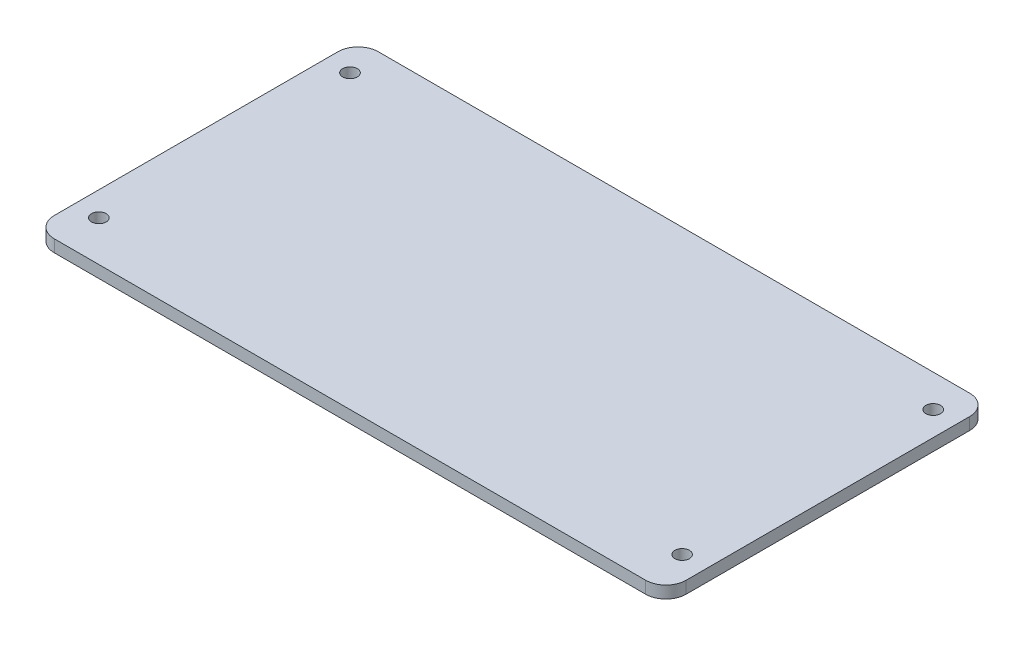
ISO-10303-21;
HEADER;
FILE_DESCRIPTION(('STEP AP214'),'2;1');
FILE_NAME('part.step','',(''),(''),'','','');
FILE_SCHEMA(('AUTOMOTIVE_DESIGN { 1 0 10303 214 1 1 1 1 }'));
ENDSEC;
DATA;
#1=APPLICATION_CONTEXT('core data for automotive mechanical design processes');
#2=APPLICATION_PROTOCOL_DEFINITION('international standard','automotive_design',2000,#1);
#3=PRODUCT_CONTEXT('',#1,'mechanical');
#4=PRODUCT('Part','Part','',(#3));
#5=PRODUCT_RELATED_PRODUCT_CATEGORY('part','',(#4));
#6=PRODUCT_DEFINITION_FORMATION('','',#4);
#7=PRODUCT_DEFINITION_CONTEXT('part definition',#1,'design');
#8=PRODUCT_DEFINITION('design','',#6,#7);
#9=PRODUCT_DEFINITION_SHAPE('','',#8);
#10=(LENGTH_UNIT() NAMED_UNIT(*) SI_UNIT(.MILLI.,.METRE.));
#11=(NAMED_UNIT(*) PLANE_ANGLE_UNIT() SI_UNIT($,.RADIAN.));
#12=(NAMED_UNIT(*) SI_UNIT($,.STERADIAN.) SOLID_ANGLE_UNIT());
#13=UNCERTAINTY_MEASURE_WITH_UNIT(LENGTH_MEASURE(1.E-05),#10,'distance_accuracy_value','');
#14=(GEOMETRIC_REPRESENTATION_CONTEXT(3) GLOBAL_UNCERTAINTY_ASSIGNED_CONTEXT((#13)) GLOBAL_UNIT_ASSIGNED_CONTEXT((#10,
#11,#12)) REPRESENTATION_CONTEXT('',''));
#15=CARTESIAN_POINT('',(0.,0.,0.));
#16=DIRECTION('',(0.,0.,1.));
#17=DIRECTION('',(1.,0.,0.));
#18=AXIS2_PLACEMENT_3D('',#15,#16,#17);
#19=CARTESIAN_POINT('',(0.,3.,0.));
#20=DIRECTION('',(0.,-1.,0.));
#21=DIRECTION('',(0.,0.,-1.));
#22=AXIS2_PLACEMENT_3D('',#19,#20,#21);
#23=PLANE('',#22);
#24=DIRECTION('',(-1.,0.,0.));
#25=VECTOR('',#24,1.);
#26=CARTESIAN_POINT('',(0.,3.,0.));
#27=LINE('',#26,#25);
#28=CARTESIAN_POINT('',(-5.,3.,0.));
#29=VERTEX_POINT('',#28);
#30=CARTESIAN_POINT('',(-151.,3.,0.));
#31=VERTEX_POINT('',#30);
#32=EDGE_CURVE('E169',#29,#31,#27,.T.);
#33=ORIENTED_EDGE('',*,*,#32,.T.);
#34=CARTESIAN_POINT('',(-151.,3.,5.));
#35=DIRECTION('',(0.,-1.,0.));
#36=DIRECTION('',(0.,0.,-1.));
#37=AXIS2_PLACEMENT_3D('',#34,#35,#36);
#38=CIRCLE('',#37,5.);
#39=CARTESIAN_POINT('',(-156.,3.,5.));
#40=VERTEX_POINT('',#39);
#41=EDGE_CURVE('E147',#31,#40,#38,.F.);
#42=ORIENTED_EDGE('',*,*,#41,.T.);
#43=DIRECTION('',(0.,0.,1.));
#44=VECTOR('',#43,1.);
#45=CARTESIAN_POINT('',(-156.,3.,0.));
#46=LINE('',#45,#44);
#47=CARTESIAN_POINT('',(-156.,3.,75.));
#48=VERTEX_POINT('',#47);
#49=EDGE_CURVE('E117',#40,#48,#46,.T.);
#50=ORIENTED_EDGE('',*,*,#49,.T.);
#51=CARTESIAN_POINT('',(-151.,3.,75.));
#52=DIRECTION('',(0.,-1.,0.));
#53=DIRECTION('',(0.,0.,-1.));
#54=AXIS2_PLACEMENT_3D('',#51,#52,#53);
#55=CIRCLE('',#54,5.);
#56=CARTESIAN_POINT('',(-151.,3.,80.));
#57=VERTEX_POINT('',#56);
#58=EDGE_CURVE('E53',#48,#57,#55,.F.);
#59=ORIENTED_EDGE('',*,*,#58,.T.);
#60=DIRECTION('',(1.,0.,0.));
#61=VECTOR('',#60,1.);
#62=CARTESIAN_POINT('',(0.,3.,80.));
#63=LINE('',#62,#61);
#64=CARTESIAN_POINT('',(-4.99999999999999,3.,80.));
#65=VERTEX_POINT('',#64);
#66=EDGE_CURVE('E133',#57,#65,#63,.T.);
#67=ORIENTED_EDGE('',*,*,#66,.T.);
#68=CARTESIAN_POINT('',(-4.99999999999999,3.,75.));
#69=DIRECTION('',(0.,-1.,0.));
#70=DIRECTION('',(0.,0.,-1.));
#71=AXIS2_PLACEMENT_3D('',#68,#69,#70);
#72=CIRCLE('',#71,5.);
#73=CARTESIAN_POINT('',(0.,3.,75.));
#74=VERTEX_POINT('',#73);
#75=EDGE_CURVE('E143',#65,#74,#72,.F.);
#76=ORIENTED_EDGE('',*,*,#75,.T.);
#77=DIRECTION('',(0.,0.,-1.));
#78=VECTOR('',#77,1.);
#79=CARTESIAN_POINT('',(0.,3.,0.));
#80=LINE('',#79,#78);
#81=CARTESIAN_POINT('',(0.,3.,5.));
#82=VERTEX_POINT('',#81);
#83=EDGE_CURVE('E127',#74,#82,#80,.T.);
#84=ORIENTED_EDGE('',*,*,#83,.T.);
#85=CARTESIAN_POINT('',(-5.,3.,5.));
#86=DIRECTION('',(0.,-1.,0.));
#87=DIRECTION('',(0.,0.,-1.));
#88=AXIS2_PLACEMENT_3D('',#85,#86,#87);
#89=CIRCLE('',#88,5.);
#90=EDGE_CURVE('E145',#82,#29,#89,.F.);
#91=ORIENTED_EDGE('',*,*,#90,.T.);
#92=EDGE_LOOP('',(#33,#42,#50,#59,#67,#76,#84,#91));
#93=FACE_BOUND('',#92,.T.);
#94=CARTESIAN_POINT('',(-150.,3.,70.));
#95=DIRECTION('',(0.,1.,0.));
#96=DIRECTION('',(0.,0.,1.));
#97=AXIS2_PLACEMENT_3D('',#94,#95,#96);
#98=CIRCLE('',#97,1.80000000000001);
#99=CARTESIAN_POINT('',(-150.,3.,71.8));
#100=VERTEX_POINT('',#99);
#101=EDGE_CURVE('E178',#100,#100,#98,.T.);
#102=ORIENTED_EDGE('',*,*,#101,.F.);
#103=EDGE_LOOP('',(#102));
#104=FACE_BOUND('',#103,.T.);
#105=CARTESIAN_POINT('',(-6.00000000000001,3.,70.));
#106=DIRECTION('',(0.,1.,0.));
#107=DIRECTION('',(0.,0.,1.));
#108=AXIS2_PLACEMENT_3D('',#105,#106,#107);
#109=CIRCLE('',#108,1.79999999999999);
#110=CARTESIAN_POINT('',(-6.00000000000001,3.,71.8));
#111=VERTEX_POINT('',#110);
#112=EDGE_CURVE('E183',#111,#111,#109,.T.);
#113=ORIENTED_EDGE('',*,*,#112,.F.);
#114=EDGE_LOOP('',(#113));
#115=FACE_BOUND('',#114,.T.);
#116=CARTESIAN_POINT('',(-6.00000000000023,3.,8.00000000000002));
#117=DIRECTION('',(0.,1.,0.));
#118=DIRECTION('',(0.,0.,1.));
#119=AXIS2_PLACEMENT_3D('',#116,#117,#118);
#120=CIRCLE('',#119,1.80000000000001);
#121=CARTESIAN_POINT('',(-6.00000000000023,3.,9.80000000000003));
#122=VERTEX_POINT('',#121);
#123=EDGE_CURVE('E188',#122,#122,#120,.T.);
#124=ORIENTED_EDGE('',*,*,#123,.F.);
#125=EDGE_LOOP('',(#124));
#126=FACE_BOUND('',#125,.T.);
#127=CARTESIAN_POINT('',(-150.,3.,8.00000000000002));
#128=DIRECTION('',(0.,1.,0.));
#129=DIRECTION('',(0.,0.,1.));
#130=AXIS2_PLACEMENT_3D('',#127,#128,#129);
#131=CIRCLE('',#130,1.80000000000001);
#132=CARTESIAN_POINT('',(-150.,3.,9.80000000000003));
#133=VERTEX_POINT('',#132);
#134=EDGE_CURVE('E194',#133,#133,#131,.T.);
#135=ORIENTED_EDGE('',*,*,#134,.F.);
#136=EDGE_LOOP('',(#135));
#137=FACE_BOUND('',#136,.T.);
#138=ADVANCED_FACE('F33',(#93,#104,#115,#126,#137),#23,.F.);
#139=CARTESIAN_POINT('',(0.,0.,0.));
#140=DIRECTION('',(0.,-1.,0.));
#141=DIRECTION('',(0.,0.,-1.));
#142=AXIS2_PLACEMENT_3D('',#139,#140,#141);
#143=PLANE('',#142);
#144=CARTESIAN_POINT('',(-6.00000000000023,0.,8.00000000000002));
#145=DIRECTION('',(0.,1.,0.));
#146=DIRECTION('',(0.,0.,1.));
#147=AXIS2_PLACEMENT_3D('',#144,#145,#146);
#148=CIRCLE('',#147,1.80000000000001);
#149=CARTESIAN_POINT('',(-6.00000000000023,0.,9.80000000000003));
#150=VERTEX_POINT('',#149);
#151=EDGE_CURVE('E191',#150,#150,#148,.T.);
#152=ORIENTED_EDGE('',*,*,#151,.T.);
#153=EDGE_LOOP('',(#152));
#154=FACE_BOUND('',#153,.T.);
#155=CARTESIAN_POINT('',(-150.,0.,70.));
#156=DIRECTION('',(0.,1.,0.));
#157=DIRECTION('',(0.,0.,1.));
#158=AXIS2_PLACEMENT_3D('',#155,#156,#157);
#159=CIRCLE('',#158,1.80000000000001);
#160=CARTESIAN_POINT('',(-150.,0.,71.8));
#161=VERTEX_POINT('',#160);
#162=EDGE_CURVE('E174',#161,#161,#159,.T.);
#163=ORIENTED_EDGE('',*,*,#162,.T.);
#164=EDGE_LOOP('',(#163));
#165=FACE_BOUND('',#164,.T.);
#166=DIRECTION('',(0.,0.,1.));
#167=VECTOR('',#166,1.);
#168=CARTESIAN_POINT('',(-156.,0.,0.));
#169=LINE('',#168,#167);
#170=CARTESIAN_POINT('',(-156.,0.,5.));
#171=VERTEX_POINT('',#170);
#172=CARTESIAN_POINT('',(-156.,0.,75.));
#173=VERTEX_POINT('',#172);
#174=EDGE_CURVE('E115',#171,#173,#169,.T.);
#175=ORIENTED_EDGE('',*,*,#174,.F.);
#176=CARTESIAN_POINT('',(-151.,0.,5.));
#177=DIRECTION('',(0.,-1.,0.));
#178=DIRECTION('',(0.,0.,-1.));
#179=AXIS2_PLACEMENT_3D('',#176,#177,#178);
#180=CIRCLE('',#179,5.);
#181=CARTESIAN_POINT('',(-151.,0.,0.));
#182=VERTEX_POINT('',#181);
#183=EDGE_CURVE('E98',#171,#182,#180,.T.);
#184=ORIENTED_EDGE('',*,*,#183,.T.);
#185=DIRECTION('',(-1.,0.,0.));
#186=VECTOR('',#185,1.);
#187=CARTESIAN_POINT('',(0.,0.,0.));
#188=LINE('',#187,#186);
#189=CARTESIAN_POINT('',(-5.,0.,0.));
#190=VERTEX_POINT('',#189);
#191=EDGE_CURVE('E125',#190,#182,#188,.T.);
#192=ORIENTED_EDGE('',*,*,#191,.F.);
#193=CARTESIAN_POINT('',(-5.,0.,5.));
#194=DIRECTION('',(0.,-1.,0.));
#195=DIRECTION('',(0.,0.,-1.));
#196=AXIS2_PLACEMENT_3D('',#193,#194,#195);
#197=CIRCLE('',#196,5.);
#198=CARTESIAN_POINT('',(0.,0.,5.));
#199=VERTEX_POINT('',#198);
#200=EDGE_CURVE('E109',#190,#199,#197,.T.);
#201=ORIENTED_EDGE('',*,*,#200,.T.);
#202=DIRECTION('',(0.,0.,-1.));
#203=VECTOR('',#202,1.);
#204=CARTESIAN_POINT('',(0.,0.,0.));
#205=LINE('',#204,#203);
#206=CARTESIAN_POINT('',(0.,0.,75.));
#207=VERTEX_POINT('',#206);
#208=EDGE_CURVE('E129',#207,#199,#205,.T.);
#209=ORIENTED_EDGE('',*,*,#208,.F.);
#210=CARTESIAN_POINT('',(-4.99999999999999,0.,75.));
#211=DIRECTION('',(0.,-1.,0.));
#212=DIRECTION('',(0.,0.,-1.));
#213=AXIS2_PLACEMENT_3D('',#210,#211,#212);
#214=CIRCLE('',#213,5.);
#215=CARTESIAN_POINT('',(-4.99999999999999,0.,80.));
#216=VERTEX_POINT('',#215);
#217=EDGE_CURVE('E136',#207,#216,#214,.T.);
#218=ORIENTED_EDGE('',*,*,#217,.T.);
#219=DIRECTION('',(1.,0.,0.));
#220=VECTOR('',#219,1.);
#221=CARTESIAN_POINT('',(0.,0.,80.));
#222=LINE('',#221,#220);
#223=CARTESIAN_POINT('',(-151.,0.,80.));
#224=VERTEX_POINT('',#223);
#225=EDGE_CURVE('E124',#224,#216,#222,.T.);
#226=ORIENTED_EDGE('',*,*,#225,.F.);
#227=CARTESIAN_POINT('',(-151.,0.,75.));
#228=DIRECTION('',(0.,-1.,0.));
#229=DIRECTION('',(0.,0.,-1.));
#230=AXIS2_PLACEMENT_3D('',#227,#228,#229);
#231=CIRCLE('',#230,5.);
#232=EDGE_CURVE('E118',#224,#173,#231,.T.);
#233=ORIENTED_EDGE('',*,*,#232,.T.);
#234=EDGE_LOOP('',(#175,#184,#192,#201,#209,#218,#226,#233));
#235=FACE_BOUND('',#234,.T.);
#236=CARTESIAN_POINT('',(-6.00000000000001,0.,70.));
#237=DIRECTION('',(0.,1.,0.));
#238=DIRECTION('',(0.,0.,1.));
#239=AXIS2_PLACEMENT_3D('',#236,#237,#238);
#240=CIRCLE('',#239,1.79999999999999);
#241=CARTESIAN_POINT('',(-6.00000000000001,0.,71.8));
#242=VERTEX_POINT('',#241);
#243=EDGE_CURVE('E185',#242,#242,#240,.T.);
#244=ORIENTED_EDGE('',*,*,#243,.T.);
#245=EDGE_LOOP('',(#244));
#246=FACE_BOUND('',#245,.T.);
#247=CARTESIAN_POINT('',(-150.,0.,8.00000000000002));
#248=DIRECTION('',(0.,1.,0.));
#249=DIRECTION('',(0.,0.,1.));
#250=AXIS2_PLACEMENT_3D('',#247,#248,#249);
#251=CIRCLE('',#250,1.80000000000001);
#252=CARTESIAN_POINT('',(-150.,0.,9.80000000000003));
#253=VERTEX_POINT('',#252);
#254=EDGE_CURVE('E197',#253,#253,#251,.T.);
#255=ORIENTED_EDGE('',*,*,#254,.T.);
#256=EDGE_LOOP('',(#255));
#257=FACE_BOUND('',#256,.T.);
#258=ADVANCED_FACE('F121',(#154,#165,#235,#246,#257),#143,.T.);
#259=CARTESIAN_POINT('',(0.,3.,0.));
#260=DIRECTION('',(-1.,0.,0.));
#261=DIRECTION('',(0.,0.,1.));
#262=AXIS2_PLACEMENT_3D('',#259,#260,#261);
#263=PLANE('',#262);
#264=ORIENTED_EDGE('',*,*,#208,.T.);
#265=DIRECTION('',(0.,-1.,0.));
#266=VECTOR('',#265,1.);
#267=CARTESIAN_POINT('',(0.,3.,5.));
#268=LINE('',#267,#266);
#269=EDGE_CURVE('E152',#199,#82,#268,.F.);
#270=ORIENTED_EDGE('',*,*,#269,.T.);
#271=ORIENTED_EDGE('',*,*,#83,.F.);
#272=DIRECTION('',(0.,-1.,0.));
#273=VECTOR('',#272,1.);
#274=CARTESIAN_POINT('',(0.,3.,75.));
#275=LINE('',#274,#273);
#276=EDGE_CURVE('E149',#74,#207,#275,.T.);
#277=ORIENTED_EDGE('',*,*,#276,.T.);
#278=EDGE_LOOP('',(#264,#270,#271,#277));
#279=FACE_BOUND('',#278,.T.);
#280=ADVANCED_FACE('F165',(#279),#263,.F.);
#281=CARTESIAN_POINT('',(0.,3.,0.));
#282=DIRECTION('',(0.,0.,1.));
#283=DIRECTION('',(1.,0.,0.));
#284=AXIS2_PLACEMENT_3D('',#281,#282,#283);
#285=PLANE('',#284);
#286=ORIENTED_EDGE('',*,*,#191,.T.);
#287=DIRECTION('',(0.,-1.,0.));
#288=VECTOR('',#287,1.);
#289=CARTESIAN_POINT('',(-151.,3.,0.));
#290=LINE('',#289,#288);
#291=EDGE_CURVE('E103',#182,#31,#290,.F.);
#292=ORIENTED_EDGE('',*,*,#291,.T.);
#293=ORIENTED_EDGE('',*,*,#32,.F.);
#294=DIRECTION('',(0.,-1.,0.));
#295=VECTOR('',#294,1.);
#296=CARTESIAN_POINT('',(-5.,3.,0.));
#297=LINE('',#296,#295);
#298=EDGE_CURVE('E108',#29,#190,#297,.T.);
#299=ORIENTED_EDGE('',*,*,#298,.T.);
#300=EDGE_LOOP('',(#286,#292,#293,#299));
#301=FACE_BOUND('',#300,.T.);
#302=ADVANCED_FACE('F222',(#301),#285,.F.);
#303=CARTESIAN_POINT('',(-156.,3.,0.));
#304=DIRECTION('',(1.,0.,0.));
#305=DIRECTION('',(0.,0.,-1.));
#306=AXIS2_PLACEMENT_3D('',#303,#304,#305);
#307=PLANE('',#306);
#308=ORIENTED_EDGE('',*,*,#49,.F.);
#309=DIRECTION('',(0.,-1.,0.));
#310=VECTOR('',#309,1.);
#311=CARTESIAN_POINT('',(-156.,3.,5.));
#312=LINE('',#311,#310);
#313=EDGE_CURVE('E102',#40,#171,#312,.T.);
#314=ORIENTED_EDGE('',*,*,#313,.T.);
#315=ORIENTED_EDGE('',*,*,#174,.T.);
#316=DIRECTION('',(0.,-1.,0.));
#317=VECTOR('',#316,1.);
#318=CARTESIAN_POINT('',(-156.,3.,75.));
#319=LINE('',#318,#317);
#320=EDGE_CURVE('E119',#173,#48,#319,.F.);
#321=ORIENTED_EDGE('',*,*,#320,.T.);
#322=EDGE_LOOP('',(#308,#314,#315,#321));
#323=FACE_BOUND('',#322,.T.);
#324=ADVANCED_FACE('F114',(#323),#307,.F.);
#325=CARTESIAN_POINT('',(0.,3.,80.));
#326=DIRECTION('',(0.,0.,-1.));
#327=DIRECTION('',(-1.,0.,0.));
#328=AXIS2_PLACEMENT_3D('',#325,#326,#327);
#329=PLANE('',#328);
#330=ORIENTED_EDGE('',*,*,#225,.T.);
#331=DIRECTION('',(0.,-1.,0.));
#332=VECTOR('',#331,1.);
#333=CARTESIAN_POINT('',(-4.99999999999999,3.,80.));
#334=LINE('',#333,#332);
#335=EDGE_CURVE('E11',#216,#65,#334,.F.);
#336=ORIENTED_EDGE('',*,*,#335,.T.);
#337=ORIENTED_EDGE('',*,*,#66,.F.);
#338=DIRECTION('',(0.,-1.,0.));
#339=VECTOR('',#338,1.);
#340=CARTESIAN_POINT('',(-151.,3.,80.));
#341=LINE('',#340,#339);
#342=EDGE_CURVE('E41',#57,#224,#341,.T.);
#343=ORIENTED_EDGE('',*,*,#342,.T.);
#344=EDGE_LOOP('',(#330,#336,#337,#343));
#345=FACE_BOUND('',#344,.T.);
#346=ADVANCED_FACE('F155',(#345),#329,.F.);
#347=CARTESIAN_POINT('',(-150.,3.,70.));
#348=DIRECTION('',(0.,-1.,0.));
#349=DIRECTION('',(0.,0.,-1.));
#350=AXIS2_PLACEMENT_3D('',#347,#348,#349);
#351=CYLINDRICAL_SURFACE('',#350,1.80000000000001);
#352=ORIENTED_EDGE('',*,*,#101,.T.);
#353=EDGE_LOOP('',(#352));
#354=FACE_BOUND('',#353,.T.);
#355=ORIENTED_EDGE('',*,*,#162,.F.);
#356=EDGE_LOOP('',(#355));
#357=FACE_BOUND('',#356,.T.);
#358=ADVANCED_FACE('F215',(#354,#357),#351,.F.);
#359=CARTESIAN_POINT('',(-6.00000000000001,3.,70.));
#360=DIRECTION('',(0.,-1.,0.));
#361=DIRECTION('',(0.,0.,-1.));
#362=AXIS2_PLACEMENT_3D('',#359,#360,#361);
#363=CYLINDRICAL_SURFACE('',#362,1.79999999999999);
#364=ORIENTED_EDGE('',*,*,#112,.T.);
#365=EDGE_LOOP('',(#364));
#366=FACE_BOUND('',#365,.T.);
#367=ORIENTED_EDGE('',*,*,#243,.F.);
#368=EDGE_LOOP('',(#367));
#369=FACE_BOUND('',#368,.T.);
#370=ADVANCED_FACE('F311',(#366,#369),#363,.F.);
#371=CARTESIAN_POINT('',(-6.00000000000023,3.,8.00000000000002));
#372=DIRECTION('',(0.,-1.,0.));
#373=DIRECTION('',(0.,0.,-1.));
#374=AXIS2_PLACEMENT_3D('',#371,#372,#373);
#375=CYLINDRICAL_SURFACE('',#374,1.80000000000001);
#376=ORIENTED_EDGE('',*,*,#123,.T.);
#377=EDGE_LOOP('',(#376));
#378=FACE_BOUND('',#377,.T.);
#379=ORIENTED_EDGE('',*,*,#151,.F.);
#380=EDGE_LOOP('',(#379));
#381=FACE_BOUND('',#380,.T.);
#382=ADVANCED_FACE('F302',(#378,#381),#375,.F.);
#383=CARTESIAN_POINT('',(-150.,3.,8.00000000000002));
#384=DIRECTION('',(0.,-1.,0.));
#385=DIRECTION('',(0.,0.,-1.));
#386=AXIS2_PLACEMENT_3D('',#383,#384,#385);
#387=CYLINDRICAL_SURFACE('',#386,1.80000000000001);
#388=ORIENTED_EDGE('',*,*,#134,.T.);
#389=EDGE_LOOP('',(#388));
#390=FACE_BOUND('',#389,.T.);
#391=ORIENTED_EDGE('',*,*,#254,.F.);
#392=EDGE_LOOP('',(#391));
#393=FACE_BOUND('',#392,.T.);
#394=ADVANCED_FACE('F203',(#390,#393),#387,.F.);
#395=CARTESIAN_POINT('',(-151.,3.,5.));
#396=DIRECTION('',(0.,-1.,0.));
#397=DIRECTION('',(0.,0.,-1.));
#398=AXIS2_PLACEMENT_3D('',#395,#396,#397);
#399=CYLINDRICAL_SURFACE('',#398,5.);
#400=ORIENTED_EDGE('',*,*,#41,.F.);
#401=ORIENTED_EDGE('',*,*,#291,.F.);
#402=ORIENTED_EDGE('',*,*,#183,.F.);
#403=ORIENTED_EDGE('',*,*,#313,.F.);
#404=EDGE_LOOP('',(#400,#401,#402,#403));
#405=FACE_BOUND('',#404,.T.);
#406=ADVANCED_FACE('F101',(#405),#399,.T.);
#407=CARTESIAN_POINT('',(-5.,3.,5.));
#408=DIRECTION('',(0.,-1.,0.));
#409=DIRECTION('',(0.,0.,-1.));
#410=AXIS2_PLACEMENT_3D('',#407,#408,#409);
#411=CYLINDRICAL_SURFACE('',#410,5.);
#412=ORIENTED_EDGE('',*,*,#90,.F.);
#413=ORIENTED_EDGE('',*,*,#269,.F.);
#414=ORIENTED_EDGE('',*,*,#200,.F.);
#415=ORIENTED_EDGE('',*,*,#298,.F.);
#416=EDGE_LOOP('',(#412,#413,#414,#415));
#417=FACE_BOUND('',#416,.T.);
#418=ADVANCED_FACE('F230',(#417),#411,.T.);
#419=CARTESIAN_POINT('',(-4.99999999999999,3.,75.));
#420=DIRECTION('',(0.,-1.,0.));
#421=DIRECTION('',(0.,0.,-1.));
#422=AXIS2_PLACEMENT_3D('',#419,#420,#421);
#423=CYLINDRICAL_SURFACE('',#422,5.);
#424=ORIENTED_EDGE('',*,*,#75,.F.);
#425=ORIENTED_EDGE('',*,*,#335,.F.);
#426=ORIENTED_EDGE('',*,*,#217,.F.);
#427=ORIENTED_EDGE('',*,*,#276,.F.);
#428=EDGE_LOOP('',(#424,#425,#426,#427));
#429=FACE_BOUND('',#428,.T.);
#430=ADVANCED_FACE('F162',(#429),#423,.T.);
#431=CARTESIAN_POINT('',(-151.,3.,75.));
#432=DIRECTION('',(0.,-1.,0.));
#433=DIRECTION('',(0.,0.,-1.));
#434=AXIS2_PLACEMENT_3D('',#431,#432,#433);
#435=CYLINDRICAL_SURFACE('',#434,5.);
#436=ORIENTED_EDGE('',*,*,#58,.F.);
#437=ORIENTED_EDGE('',*,*,#320,.F.);
#438=ORIENTED_EDGE('',*,*,#232,.F.);
#439=ORIENTED_EDGE('',*,*,#342,.F.);
#440=EDGE_LOOP('',(#436,#437,#438,#439));
#441=FACE_BOUND('',#440,.T.);
#442=ADVANCED_FACE('F35',(#441),#435,.T.);
#443=CLOSED_SHELL('',(#138,#258,#280,#302,#324,#346,#358,#370,#382,#394,#406,#418,#430,#442));
#444=MANIFOLD_SOLID_BREP('B2',#443);
#445=ADVANCED_BREP_SHAPE_REPRESENTATION('',(#18,#444),#14);
#446=SHAPE_DEFINITION_REPRESENTATION(#9,#445);
ENDSEC;
END-ISO-10303-21;
